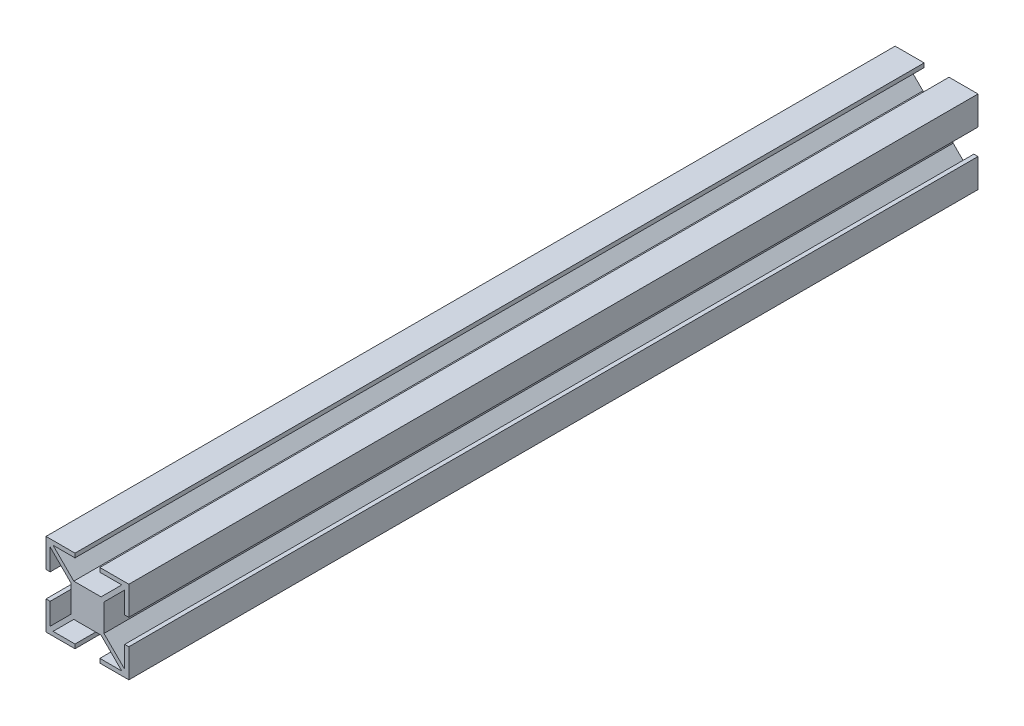
ISO-10303-21;
HEADER;
FILE_DESCRIPTION(('STEP AP214'),'2;1');
FILE_NAME('part.step','',(''),(''),'','','');
FILE_SCHEMA(('AUTOMOTIVE_DESIGN { 1 0 10303 214 1 1 1 1 }'));
ENDSEC;
DATA;
#1=APPLICATION_CONTEXT('core data for automotive mechanical design processes');
#2=APPLICATION_PROTOCOL_DEFINITION('international standard','automotive_design',2000,#1);
#3=PRODUCT_CONTEXT('',#1,'mechanical');
#4=PRODUCT('Part','Part','',(#3));
#5=PRODUCT_RELATED_PRODUCT_CATEGORY('part','',(#4));
#6=PRODUCT_DEFINITION_FORMATION('','',#4);
#7=PRODUCT_DEFINITION_CONTEXT('part definition',#1,'design');
#8=PRODUCT_DEFINITION('design','',#6,#7);
#9=PRODUCT_DEFINITION_SHAPE('','',#8);
#10=(LENGTH_UNIT() NAMED_UNIT(*) SI_UNIT(.MILLI.,.METRE.));
#11=(NAMED_UNIT(*) PLANE_ANGLE_UNIT() SI_UNIT($,.RADIAN.));
#12=(NAMED_UNIT(*) SI_UNIT($,.STERADIAN.) SOLID_ANGLE_UNIT());
#13=UNCERTAINTY_MEASURE_WITH_UNIT(LENGTH_MEASURE(1.E-05),#10,'distance_accuracy_value','');
#14=(GEOMETRIC_REPRESENTATION_CONTEXT(3) GLOBAL_UNCERTAINTY_ASSIGNED_CONTEXT((#13)) GLOBAL_UNIT_ASSIGNED_CONTEXT((#10,
#11,#12)) REPRESENTATION_CONTEXT('',''));
#15=CARTESIAN_POINT('',(0.,0.,0.));
#16=DIRECTION('',(0.,0.,1.));
#17=DIRECTION('',(1.,0.,0.));
#18=AXIS2_PLACEMENT_3D('',#15,#16,#17);
#19=CARTESIAN_POINT('',(10.,10.,205.));
#20=DIRECTION('',(0.,-1.,0.));
#21=DIRECTION('',(0.,0.,-1.));
#22=AXIS2_PLACEMENT_3D('',#19,#20,#21);
#23=PLANE('',#22);
#24=DIRECTION('',(-1.,0.,0.));
#25=VECTOR('',#24,1.);
#26=CARTESIAN_POINT('',(10.,10.,0.));
#27=LINE('',#26,#25);
#28=CARTESIAN_POINT('',(10.,10.,0.));
#29=VERTEX_POINT('',#28);
#30=CARTESIAN_POINT('',(3.,10.,0.));
#31=VERTEX_POINT('',#30);
#32=EDGE_CURVE('E297',#29,#31,#27,.T.);
#33=ORIENTED_EDGE('',*,*,#32,.T.);
#34=DIRECTION('',(0.,0.,-1.));
#35=VECTOR('',#34,1.);
#36=CARTESIAN_POINT('',(3.,10.,205.));
#37=LINE('',#36,#35);
#38=CARTESIAN_POINT('',(3.,10.,205.));
#39=VERTEX_POINT('',#38);
#40=EDGE_CURVE('E11',#39,#31,#37,.T.);
#41=ORIENTED_EDGE('',*,*,#40,.F.);
#42=DIRECTION('',(-1.,0.,0.));
#43=VECTOR('',#42,1.);
#44=CARTESIAN_POINT('',(10.,10.,205.));
#45=LINE('',#44,#43);
#46=CARTESIAN_POINT('',(10.,10.,205.));
#47=VERTEX_POINT('',#46);
#48=EDGE_CURVE('E367',#47,#39,#45,.T.);
#49=ORIENTED_EDGE('',*,*,#48,.F.);
#50=DIRECTION('',(0.,0.,-1.));
#51=VECTOR('',#50,1.);
#52=CARTESIAN_POINT('',(10.,10.,205.));
#53=LINE('',#52,#51);
#54=EDGE_CURVE('E293',#47,#29,#53,.T.);
#55=ORIENTED_EDGE('',*,*,#54,.T.);
#56=EDGE_LOOP('',(#33,#41,#49,#55));
#57=FACE_BOUND('',#56,.T.);
#58=ADVANCED_FACE('F33',(#57),#23,.F.);
#59=CARTESIAN_POINT('',(3.,10.,205.));
#60=DIRECTION('',(1.,0.,0.));
#61=DIRECTION('',(0.,0.,-1.));
#62=AXIS2_PLACEMENT_3D('',#59,#60,#61);
#63=PLANE('',#62);
#64=DIRECTION('',(0.,-1.,0.));
#65=VECTOR('',#64,1.);
#66=CARTESIAN_POINT('',(3.,10.,0.));
#67=LINE('',#66,#65);
#68=CARTESIAN_POINT('',(3.,9.,0.));
#69=VERTEX_POINT('',#68);
#70=EDGE_CURVE('E300',#31,#69,#67,.T.);
#71=ORIENTED_EDGE('',*,*,#70,.T.);
#72=DIRECTION('',(0.,0.,-1.));
#73=VECTOR('',#72,1.);
#74=CARTESIAN_POINT('',(3.,9.,205.));
#75=LINE('',#74,#73);
#76=CARTESIAN_POINT('',(3.,9.,205.));
#77=VERTEX_POINT('',#76);
#78=EDGE_CURVE('E41',#77,#69,#75,.T.);
#79=ORIENTED_EDGE('',*,*,#78,.F.);
#80=DIRECTION('',(0.,-1.,0.));
#81=VECTOR('',#80,1.);
#82=CARTESIAN_POINT('',(3.,10.,205.));
#83=LINE('',#82,#81);
#84=EDGE_CURVE('E176',#39,#77,#83,.T.);
#85=ORIENTED_EDGE('',*,*,#84,.F.);
#86=ORIENTED_EDGE('',*,*,#40,.T.);
#87=EDGE_LOOP('',(#71,#79,#85,#86));
#88=FACE_BOUND('',#87,.T.);
#89=ADVANCED_FACE('F565',(#88),#63,.F.);
#90=CARTESIAN_POINT('',(8.29289321881345,9.,205.));
#91=DIRECTION('',(0.,1.,0.));
#92=DIRECTION('',(0.,0.,1.));
#93=AXIS2_PLACEMENT_3D('',#90,#91,#92);
#94=PLANE('',#93);
#95=DIRECTION('',(1.,0.,0.));
#96=VECTOR('',#95,1.);
#97=CARTESIAN_POINT('',(8.29289321881345,9.,0.));
#98=LINE('',#97,#96);
#99=CARTESIAN_POINT('',(8.29289321881345,9.,0.));
#100=VERTEX_POINT('',#99);
#101=EDGE_CURVE('E302',#69,#100,#98,.T.);
#102=ORIENTED_EDGE('',*,*,#101,.T.);
#103=DIRECTION('',(0.,0.,-1.));
#104=VECTOR('',#103,1.);
#105=CARTESIAN_POINT('',(8.29289321881345,9.,205.));
#106=LINE('',#105,#104);
#107=CARTESIAN_POINT('',(8.29289321881345,9.,205.));
#108=VERTEX_POINT('',#107);
#109=EDGE_CURVE('E458',#108,#100,#106,.T.);
#110=ORIENTED_EDGE('',*,*,#109,.F.);
#111=DIRECTION('',(1.,0.,0.));
#112=VECTOR('',#111,1.);
#113=CARTESIAN_POINT('',(8.29289321881345,9.,205.));
#114=LINE('',#113,#112);
#115=EDGE_CURVE('E466',#77,#108,#114,.T.);
#116=ORIENTED_EDGE('',*,*,#115,.F.);
#117=ORIENTED_EDGE('',*,*,#78,.T.);
#118=EDGE_LOOP('',(#102,#110,#116,#117));
#119=FACE_BOUND('',#118,.T.);
#120=ADVANCED_FACE('F464',(#119),#94,.F.);
#121=CARTESIAN_POINT('',(8.29289321881345,9.,205.));
#122=DIRECTION('',(0.707106781186548,-0.707106781186547,0.));
#123=DIRECTION('',(0.707106781186547,0.707106781186548,0.));
#124=AXIS2_PLACEMENT_3D('',#121,#122,#123);
#125=PLANE('',#124);
#126=DIRECTION('',(-0.707106781186547,-0.707106781186548,0.));
#127=VECTOR('',#126,1.);
#128=CARTESIAN_POINT('',(8.29289321881345,9.,0.));
#129=LINE('',#128,#127);
#130=CARTESIAN_POINT('',(3.29289321881345,4.,0.));
#131=VERTEX_POINT('',#130);
#132=EDGE_CURVE('E304',#100,#131,#129,.T.);
#133=ORIENTED_EDGE('',*,*,#132,.T.);
#134=DIRECTION('',(0.,0.,-1.));
#135=VECTOR('',#134,1.);
#136=CARTESIAN_POINT('',(3.29289321881345,4.,205.));
#137=LINE('',#136,#135);
#138=CARTESIAN_POINT('',(3.29289321881345,4.,205.));
#139=VERTEX_POINT('',#138);
#140=EDGE_CURVE('E455',#139,#131,#137,.T.);
#141=ORIENTED_EDGE('',*,*,#140,.F.);
#142=DIRECTION('',(-0.707106781186547,-0.707106781186548,0.));
#143=VECTOR('',#142,1.);
#144=CARTESIAN_POINT('',(8.29289321881345,9.,205.));
#145=LINE('',#144,#143);
#146=EDGE_CURVE('E484',#108,#139,#145,.T.);
#147=ORIENTED_EDGE('',*,*,#146,.F.);
#148=ORIENTED_EDGE('',*,*,#109,.T.);
#149=EDGE_LOOP('',(#133,#141,#147,#148));
#150=FACE_BOUND('',#149,.T.);
#151=ADVANCED_FACE('F475',(#150),#125,.F.);
#152=CARTESIAN_POINT('',(-3.29289321881345,4.,205.));
#153=DIRECTION('',(0.,-1.,0.));
#154=DIRECTION('',(0.,0.,-1.));
#155=AXIS2_PLACEMENT_3D('',#152,#153,#154);
#156=PLANE('',#155);
#157=DIRECTION('',(-1.,0.,0.));
#158=VECTOR('',#157,1.);
#159=CARTESIAN_POINT('',(-3.29289321881345,4.,0.));
#160=LINE('',#159,#158);
#161=CARTESIAN_POINT('',(-3.29289321881345,4.,0.));
#162=VERTEX_POINT('',#161);
#163=EDGE_CURVE('E306',#131,#162,#160,.T.);
#164=ORIENTED_EDGE('',*,*,#163,.T.);
#165=DIRECTION('',(0.,0.,-1.));
#166=VECTOR('',#165,1.);
#167=CARTESIAN_POINT('',(-3.29289321881345,4.,205.));
#168=LINE('',#167,#166);
#169=CARTESIAN_POINT('',(-3.29289321881345,4.,205.));
#170=VERTEX_POINT('',#169);
#171=EDGE_CURVE('E452',#170,#162,#168,.T.);
#172=ORIENTED_EDGE('',*,*,#171,.F.);
#173=DIRECTION('',(-1.,0.,0.));
#174=VECTOR('',#173,1.);
#175=CARTESIAN_POINT('',(-3.29289321881345,4.,205.));
#176=LINE('',#175,#174);
#177=EDGE_CURVE('E481',#139,#170,#176,.T.);
#178=ORIENTED_EDGE('',*,*,#177,.F.);
#179=ORIENTED_EDGE('',*,*,#140,.T.);
#180=EDGE_LOOP('',(#164,#172,#178,#179));
#181=FACE_BOUND('',#180,.T.);
#182=ADVANCED_FACE('F479',(#181),#156,.F.);
#183=CARTESIAN_POINT('',(-8.29289321881345,9.,205.));
#184=DIRECTION('',(-0.707106781186548,-0.707106781186547,0.));
#185=DIRECTION('',(0.707106781186547,-0.707106781186548,0.));
#186=AXIS2_PLACEMENT_3D('',#183,#184,#185);
#187=PLANE('',#186);
#188=DIRECTION('',(-0.707106781186547,0.707106781186548,0.));
#189=VECTOR('',#188,1.);
#190=CARTESIAN_POINT('',(-8.29289321881345,9.,0.));
#191=LINE('',#190,#189);
#192=CARTESIAN_POINT('',(-8.29289321881345,9.,0.));
#193=VERTEX_POINT('',#192);
#194=EDGE_CURVE('E308',#162,#193,#191,.T.);
#195=ORIENTED_EDGE('',*,*,#194,.T.);
#196=DIRECTION('',(0.,0.,-1.));
#197=VECTOR('',#196,1.);
#198=CARTESIAN_POINT('',(-8.29289321881345,9.,205.));
#199=LINE('',#198,#197);
#200=CARTESIAN_POINT('',(-8.29289321881345,9.,205.));
#201=VERTEX_POINT('',#200);
#202=EDGE_CURVE('E449',#201,#193,#199,.T.);
#203=ORIENTED_EDGE('',*,*,#202,.F.);
#204=DIRECTION('',(-0.707106781186547,0.707106781186548,0.));
#205=VECTOR('',#204,1.);
#206=CARTESIAN_POINT('',(-8.29289321881345,9.,205.));
#207=LINE('',#206,#205);
#208=EDGE_CURVE('E483',#170,#201,#207,.T.);
#209=ORIENTED_EDGE('',*,*,#208,.F.);
#210=ORIENTED_EDGE('',*,*,#171,.T.);
#211=EDGE_LOOP('',(#195,#203,#209,#210));
#212=FACE_BOUND('',#211,.T.);
#213=ADVANCED_FACE('F578',(#212),#187,.F.);
#214=CARTESIAN_POINT('',(-8.29289321881345,9.,205.));
#215=DIRECTION('',(0.,1.,0.));
#216=DIRECTION('',(0.,0.,1.));
#217=AXIS2_PLACEMENT_3D('',#214,#215,#216);
#218=PLANE('',#217);
#219=DIRECTION('',(1.,0.,0.));
#220=VECTOR('',#219,1.);
#221=CARTESIAN_POINT('',(-8.29289321881345,9.,0.));
#222=LINE('',#221,#220);
#223=CARTESIAN_POINT('',(-3.,9.,0.));
#224=VERTEX_POINT('',#223);
#225=EDGE_CURVE('E310',#193,#224,#222,.T.);
#226=ORIENTED_EDGE('',*,*,#225,.T.);
#227=DIRECTION('',(0.,0.,-1.));
#228=VECTOR('',#227,1.);
#229=CARTESIAN_POINT('',(-3.,9.,205.));
#230=LINE('',#229,#228);
#231=CARTESIAN_POINT('',(-3.,9.,205.));
#232=VERTEX_POINT('',#231);
#233=EDGE_CURVE('E446',#232,#224,#230,.T.);
#234=ORIENTED_EDGE('',*,*,#233,.F.);
#235=DIRECTION('',(1.,0.,0.));
#236=VECTOR('',#235,1.);
#237=CARTESIAN_POINT('',(-8.29289321881345,9.,205.));
#238=LINE('',#237,#236);
#239=EDGE_CURVE('E486',#201,#232,#238,.T.);
#240=ORIENTED_EDGE('',*,*,#239,.F.);
#241=ORIENTED_EDGE('',*,*,#202,.T.);
#242=EDGE_LOOP('',(#226,#234,#240,#241));
#243=FACE_BOUND('',#242,.T.);
#244=ADVANCED_FACE('F581',(#243),#218,.F.);
#245=CARTESIAN_POINT('',(-3.,10.,205.));
#246=DIRECTION('',(-1.,0.,0.));
#247=DIRECTION('',(0.,0.,1.));
#248=AXIS2_PLACEMENT_3D('',#245,#246,#247);
#249=PLANE('',#248);
#250=DIRECTION('',(0.,1.,0.));
#251=VECTOR('',#250,1.);
#252=CARTESIAN_POINT('',(-3.,10.,0.));
#253=LINE('',#252,#251);
#254=CARTESIAN_POINT('',(-3.,10.,0.));
#255=VERTEX_POINT('',#254);
#256=EDGE_CURVE('E312',#224,#255,#253,.T.);
#257=ORIENTED_EDGE('',*,*,#256,.T.);
#258=DIRECTION('',(0.,0.,-1.));
#259=VECTOR('',#258,1.);
#260=CARTESIAN_POINT('',(-3.,10.,205.));
#261=LINE('',#260,#259);
#262=CARTESIAN_POINT('',(-3.,10.,205.));
#263=VERTEX_POINT('',#262);
#264=EDGE_CURVE('E443',#263,#255,#261,.T.);
#265=ORIENTED_EDGE('',*,*,#264,.F.);
#266=DIRECTION('',(0.,1.,0.));
#267=VECTOR('',#266,1.);
#268=CARTESIAN_POINT('',(-3.,10.,205.));
#269=LINE('',#268,#267);
#270=EDGE_CURVE('E492',#232,#263,#269,.T.);
#271=ORIENTED_EDGE('',*,*,#270,.F.);
#272=ORIENTED_EDGE('',*,*,#233,.T.);
#273=EDGE_LOOP('',(#257,#265,#271,#272));
#274=FACE_BOUND('',#273,.T.);
#275=ADVANCED_FACE('F585',(#274),#249,.F.);
#276=CARTESIAN_POINT('',(-10.,10.,205.));
#277=DIRECTION('',(0.,-1.,0.));
#278=DIRECTION('',(0.,0.,-1.));
#279=AXIS2_PLACEMENT_3D('',#276,#277,#278);
#280=PLANE('',#279);
#281=DIRECTION('',(-1.,0.,0.));
#282=VECTOR('',#281,1.);
#283=CARTESIAN_POINT('',(-10.,10.,0.));
#284=LINE('',#283,#282);
#285=CARTESIAN_POINT('',(-10.,10.,0.));
#286=VERTEX_POINT('',#285);
#287=EDGE_CURVE('E314',#255,#286,#284,.T.);
#288=ORIENTED_EDGE('',*,*,#287,.T.);
#289=DIRECTION('',(0.,0.,-1.));
#290=VECTOR('',#289,1.);
#291=CARTESIAN_POINT('',(-10.,10.,205.));
#292=LINE('',#291,#290);
#293=CARTESIAN_POINT('',(-10.,10.,205.));
#294=VERTEX_POINT('',#293);
#295=EDGE_CURVE('E440',#294,#286,#292,.T.);
#296=ORIENTED_EDGE('',*,*,#295,.F.);
#297=DIRECTION('',(-1.,0.,0.));
#298=VECTOR('',#297,1.);
#299=CARTESIAN_POINT('',(-10.,10.,205.));
#300=LINE('',#299,#298);
#301=EDGE_CURVE('E494',#263,#294,#300,.T.);
#302=ORIENTED_EDGE('',*,*,#301,.F.);
#303=ORIENTED_EDGE('',*,*,#264,.T.);
#304=EDGE_LOOP('',(#288,#296,#302,#303));
#305=FACE_BOUND('',#304,.T.);
#306=ADVANCED_FACE('F589',(#305),#280,.F.);
#307=CARTESIAN_POINT('',(-10.,10.,205.));
#308=DIRECTION('',(1.,0.,0.));
#309=DIRECTION('',(0.,0.,-1.));
#310=AXIS2_PLACEMENT_3D('',#307,#308,#309);
#311=PLANE('',#310);
#312=DIRECTION('',(0.,-1.,0.));
#313=VECTOR('',#312,1.);
#314=CARTESIAN_POINT('',(-10.,10.,0.));
#315=LINE('',#314,#313);
#316=CARTESIAN_POINT('',(-10.,3.07404458598726,0.));
#317=VERTEX_POINT('',#316);
#318=EDGE_CURVE('E316',#286,#317,#315,.T.);
#319=ORIENTED_EDGE('',*,*,#318,.T.);
#320=DIRECTION('',(0.,0.,-1.));
#321=VECTOR('',#320,1.);
#322=CARTESIAN_POINT('',(-10.,3.07404458598726,205.));
#323=LINE('',#322,#321);
#324=CARTESIAN_POINT('',(-10.,3.07404458598726,205.));
#325=VERTEX_POINT('',#324);
#326=EDGE_CURVE('E437',#325,#317,#323,.T.);
#327=ORIENTED_EDGE('',*,*,#326,.F.);
#328=DIRECTION('',(0.,-1.,0.));
#329=VECTOR('',#328,1.);
#330=CARTESIAN_POINT('',(-10.,10.,205.));
#331=LINE('',#330,#329);
#332=EDGE_CURVE('E496',#294,#325,#331,.T.);
#333=ORIENTED_EDGE('',*,*,#332,.F.);
#334=ORIENTED_EDGE('',*,*,#295,.T.);
#335=EDGE_LOOP('',(#319,#327,#333,#334));
#336=FACE_BOUND('',#335,.T.);
#337=ADVANCED_FACE('F593',(#336),#311,.F.);
#338=CARTESIAN_POINT('',(-10.,3.07404458598726,205.));
#339=DIRECTION('',(0.,1.,0.));
#340=DIRECTION('',(0.,0.,1.));
#341=AXIS2_PLACEMENT_3D('',#338,#339,#340);
#342=PLANE('',#341);
#343=DIRECTION('',(1.,0.,0.));
#344=VECTOR('',#343,1.);
#345=CARTESIAN_POINT('',(-10.,3.07404458598726,0.));
#346=LINE('',#345,#344);
#347=CARTESIAN_POINT('',(-9.,3.07404458598726,0.));
#348=VERTEX_POINT('',#347);
#349=EDGE_CURVE('E318',#317,#348,#346,.T.);
#350=ORIENTED_EDGE('',*,*,#349,.T.);
#351=DIRECTION('',(0.,0.,-1.));
#352=VECTOR('',#351,1.);
#353=CARTESIAN_POINT('',(-9.,3.07404458598726,205.));
#354=LINE('',#353,#352);
#355=CARTESIAN_POINT('',(-9.,3.07404458598726,205.));
#356=VERTEX_POINT('',#355);
#357=EDGE_CURVE('E434',#356,#348,#354,.T.);
#358=ORIENTED_EDGE('',*,*,#357,.F.);
#359=DIRECTION('',(1.,0.,0.));
#360=VECTOR('',#359,1.);
#361=CARTESIAN_POINT('',(-10.,3.07404458598726,205.));
#362=LINE('',#361,#360);
#363=EDGE_CURVE('E498',#325,#356,#362,.T.);
#364=ORIENTED_EDGE('',*,*,#363,.F.);
#365=ORIENTED_EDGE('',*,*,#326,.T.);
#366=EDGE_LOOP('',(#350,#358,#364,#365));
#367=FACE_BOUND('',#366,.T.);
#368=ADVANCED_FACE('F597',(#367),#342,.F.);
#369=CARTESIAN_POINT('',(-9.,8.29289321881345,205.));
#370=DIRECTION('',(-1.,0.,0.));
#371=DIRECTION('',(0.,0.,1.));
#372=AXIS2_PLACEMENT_3D('',#369,#370,#371);
#373=PLANE('',#372);
#374=DIRECTION('',(0.,1.,0.));
#375=VECTOR('',#374,1.);
#376=CARTESIAN_POINT('',(-9.,8.29289321881345,0.));
#377=LINE('',#376,#375);
#378=CARTESIAN_POINT('',(-9.,8.29289321881345,0.));
#379=VERTEX_POINT('',#378);
#380=EDGE_CURVE('E320',#348,#379,#377,.T.);
#381=ORIENTED_EDGE('',*,*,#380,.T.);
#382=DIRECTION('',(0.,0.,-1.));
#383=VECTOR('',#382,1.);
#384=CARTESIAN_POINT('',(-9.,8.29289321881345,205.));
#385=LINE('',#384,#383);
#386=CARTESIAN_POINT('',(-9.,8.29289321881345,205.));
#387=VERTEX_POINT('',#386);
#388=EDGE_CURVE('E431',#387,#379,#385,.T.);
#389=ORIENTED_EDGE('',*,*,#388,.F.);
#390=DIRECTION('',(0.,1.,0.));
#391=VECTOR('',#390,1.);
#392=CARTESIAN_POINT('',(-9.,8.29289321881345,205.));
#393=LINE('',#392,#391);
#394=EDGE_CURVE('E500',#356,#387,#393,.T.);
#395=ORIENTED_EDGE('',*,*,#394,.F.);
#396=ORIENTED_EDGE('',*,*,#357,.T.);
#397=EDGE_LOOP('',(#381,#389,#395,#396));
#398=FACE_BOUND('',#397,.T.);
#399=ADVANCED_FACE('F601',(#398),#373,.F.);
#400=CARTESIAN_POINT('',(-9.,8.29289321881345,205.));
#401=DIRECTION('',(0.707106781186547,0.707106781186547,0.));
#402=DIRECTION('',(-0.707106781186548,0.707106781186548,0.));
#403=AXIS2_PLACEMENT_3D('',#400,#401,#402);
#404=PLANE('',#403);
#405=DIRECTION('',(0.707106781186547,-0.707106781186547,0.));
#406=VECTOR('',#405,1.);
#407=CARTESIAN_POINT('',(-9.,8.29289321881345,0.));
#408=LINE('',#407,#406);
#409=CARTESIAN_POINT('',(-4.,3.29289321881345,0.));
#410=VERTEX_POINT('',#409);
#411=EDGE_CURVE('E322',#379,#410,#408,.T.);
#412=ORIENTED_EDGE('',*,*,#411,.T.);
#413=DIRECTION('',(0.,0.,-1.));
#414=VECTOR('',#413,1.);
#415=CARTESIAN_POINT('',(-4.,3.29289321881345,205.));
#416=LINE('',#415,#414);
#417=CARTESIAN_POINT('',(-4.,3.29289321881345,205.));
#418=VERTEX_POINT('',#417);
#419=EDGE_CURVE('E428',#418,#410,#416,.T.);
#420=ORIENTED_EDGE('',*,*,#419,.F.);
#421=DIRECTION('',(0.707106781186547,-0.707106781186547,0.));
#422=VECTOR('',#421,1.);
#423=CARTESIAN_POINT('',(-9.,8.29289321881345,205.));
#424=LINE('',#423,#422);
#425=EDGE_CURVE('E502',#387,#418,#424,.T.);
#426=ORIENTED_EDGE('',*,*,#425,.F.);
#427=ORIENTED_EDGE('',*,*,#388,.T.);
#428=EDGE_LOOP('',(#412,#420,#426,#427));
#429=FACE_BOUND('',#428,.T.);
#430=ADVANCED_FACE('F605',(#429),#404,.F.);
#431=CARTESIAN_POINT('',(-4.,-3.29289321881345,205.));
#432=DIRECTION('',(1.,0.,0.));
#433=DIRECTION('',(0.,0.,-1.));
#434=AXIS2_PLACEMENT_3D('',#431,#432,#433);
#435=PLANE('',#434);
#436=DIRECTION('',(0.,-1.,0.));
#437=VECTOR('',#436,1.);
#438=CARTESIAN_POINT('',(-4.,-3.29289321881345,0.));
#439=LINE('',#438,#437);
#440=CARTESIAN_POINT('',(-4.,-3.29289321881345,0.));
#441=VERTEX_POINT('',#440);
#442=EDGE_CURVE('E324',#410,#441,#439,.T.);
#443=ORIENTED_EDGE('',*,*,#442,.T.);
#444=DIRECTION('',(0.,0.,-1.));
#445=VECTOR('',#444,1.);
#446=CARTESIAN_POINT('',(-4.,-3.29289321881345,205.));
#447=LINE('',#446,#445);
#448=CARTESIAN_POINT('',(-4.,-3.29289321881345,205.));
#449=VERTEX_POINT('',#448);
#450=EDGE_CURVE('E425',#449,#441,#447,.T.);
#451=ORIENTED_EDGE('',*,*,#450,.F.);
#452=DIRECTION('',(0.,-1.,0.));
#453=VECTOR('',#452,1.);
#454=CARTESIAN_POINT('',(-4.,-3.29289321881345,205.));
#455=LINE('',#454,#453);
#456=EDGE_CURVE('E504',#418,#449,#455,.T.);
#457=ORIENTED_EDGE('',*,*,#456,.F.);
#458=ORIENTED_EDGE('',*,*,#419,.T.);
#459=EDGE_LOOP('',(#443,#451,#457,#458));
#460=FACE_BOUND('',#459,.T.);
#461=ADVANCED_FACE('F609',(#460),#435,.F.);
#462=CARTESIAN_POINT('',(-9.,-8.29289321881345,205.));
#463=DIRECTION('',(0.707106781186547,-0.707106781186547,0.));
#464=DIRECTION('',(0.707106781186548,0.707106781186548,0.));
#465=AXIS2_PLACEMENT_3D('',#462,#463,#464);
#466=PLANE('',#465);
#467=DIRECTION('',(-0.707106781186547,-0.707106781186547,0.));
#468=VECTOR('',#467,1.);
#469=CARTESIAN_POINT('',(-9.,-8.29289321881345,0.));
#470=LINE('',#469,#468);
#471=CARTESIAN_POINT('',(-9.,-8.29289321881345,0.));
#472=VERTEX_POINT('',#471);
#473=EDGE_CURVE('E326',#441,#472,#470,.T.);
#474=ORIENTED_EDGE('',*,*,#473,.T.);
#475=DIRECTION('',(0.,0.,-1.));
#476=VECTOR('',#475,1.);
#477=CARTESIAN_POINT('',(-9.,-8.29289321881345,205.));
#478=LINE('',#477,#476);
#479=CARTESIAN_POINT('',(-9.,-8.29289321881345,205.));
#480=VERTEX_POINT('',#479);
#481=EDGE_CURVE('E422',#480,#472,#478,.T.);
#482=ORIENTED_EDGE('',*,*,#481,.F.);
#483=DIRECTION('',(-0.707106781186547,-0.707106781186547,0.));
#484=VECTOR('',#483,1.);
#485=CARTESIAN_POINT('',(-9.,-8.29289321881345,205.));
#486=LINE('',#485,#484);
#487=EDGE_CURVE('E506',#449,#480,#486,.T.);
#488=ORIENTED_EDGE('',*,*,#487,.F.);
#489=ORIENTED_EDGE('',*,*,#450,.T.);
#490=EDGE_LOOP('',(#474,#482,#488,#489));
#491=FACE_BOUND('',#490,.T.);
#492=ADVANCED_FACE('F613',(#491),#466,.F.);
#493=CARTESIAN_POINT('',(-9.,-8.29289321881345,205.));
#494=DIRECTION('',(-1.,0.,0.));
#495=DIRECTION('',(0.,0.,1.));
#496=AXIS2_PLACEMENT_3D('',#493,#494,#495);
#497=PLANE('',#496);
#498=DIRECTION('',(0.,1.,0.));
#499=VECTOR('',#498,1.);
#500=CARTESIAN_POINT('',(-9.,-8.29289321881345,0.));
#501=LINE('',#500,#499);
#502=CARTESIAN_POINT('',(-9.,-3.07404458598726,0.));
#503=VERTEX_POINT('',#502);
#504=EDGE_CURVE('E328',#472,#503,#501,.T.);
#505=ORIENTED_EDGE('',*,*,#504,.T.);
#506=DIRECTION('',(0.,0.,-1.));
#507=VECTOR('',#506,1.);
#508=CARTESIAN_POINT('',(-9.,-3.07404458598726,205.));
#509=LINE('',#508,#507);
#510=CARTESIAN_POINT('',(-9.,-3.07404458598726,205.));
#511=VERTEX_POINT('',#510);
#512=EDGE_CURVE('E419',#511,#503,#509,.T.);
#513=ORIENTED_EDGE('',*,*,#512,.F.);
#514=DIRECTION('',(0.,1.,0.));
#515=VECTOR('',#514,1.);
#516=CARTESIAN_POINT('',(-9.,-8.29289321881345,205.));
#517=LINE('',#516,#515);
#518=EDGE_CURVE('E508',#480,#511,#517,.T.);
#519=ORIENTED_EDGE('',*,*,#518,.F.);
#520=ORIENTED_EDGE('',*,*,#481,.T.);
#521=EDGE_LOOP('',(#505,#513,#519,#520));
#522=FACE_BOUND('',#521,.T.);
#523=ADVANCED_FACE('F617',(#522),#497,.F.);
#524=CARTESIAN_POINT('',(-10.,-3.07404458598726,205.));
#525=DIRECTION('',(0.,-1.,0.));
#526=DIRECTION('',(0.,0.,-1.));
#527=AXIS2_PLACEMENT_3D('',#524,#525,#526);
#528=PLANE('',#527);
#529=DIRECTION('',(-1.,0.,0.));
#530=VECTOR('',#529,1.);
#531=CARTESIAN_POINT('',(-10.,-3.07404458598726,0.));
#532=LINE('',#531,#530);
#533=CARTESIAN_POINT('',(-10.,-3.07404458598726,0.));
#534=VERTEX_POINT('',#533);
#535=EDGE_CURVE('E330',#503,#534,#532,.T.);
#536=ORIENTED_EDGE('',*,*,#535,.T.);
#537=DIRECTION('',(0.,0.,-1.));
#538=VECTOR('',#537,1.);
#539=CARTESIAN_POINT('',(-10.,-3.07404458598726,205.));
#540=LINE('',#539,#538);
#541=CARTESIAN_POINT('',(-10.,-3.07404458598726,205.));
#542=VERTEX_POINT('',#541);
#543=EDGE_CURVE('E416',#542,#534,#540,.T.);
#544=ORIENTED_EDGE('',*,*,#543,.F.);
#545=DIRECTION('',(-1.,0.,0.));
#546=VECTOR('',#545,1.);
#547=CARTESIAN_POINT('',(-10.,-3.07404458598726,205.));
#548=LINE('',#547,#546);
#549=EDGE_CURVE('E510',#511,#542,#548,.T.);
#550=ORIENTED_EDGE('',*,*,#549,.F.);
#551=ORIENTED_EDGE('',*,*,#512,.T.);
#552=EDGE_LOOP('',(#536,#544,#550,#551));
#553=FACE_BOUND('',#552,.T.);
#554=ADVANCED_FACE('F621',(#553),#528,.F.);
#555=CARTESIAN_POINT('',(-10.,-10.,205.));
#556=DIRECTION('',(1.,0.,0.));
#557=DIRECTION('',(0.,0.,-1.));
#558=AXIS2_PLACEMENT_3D('',#555,#556,#557);
#559=PLANE('',#558);
#560=DIRECTION('',(0.,-1.,0.));
#561=VECTOR('',#560,1.);
#562=CARTESIAN_POINT('',(-10.,-10.,0.));
#563=LINE('',#562,#561);
#564=CARTESIAN_POINT('',(-10.,-10.,0.));
#565=VERTEX_POINT('',#564);
#566=EDGE_CURVE('E332',#534,#565,#563,.T.);
#567=ORIENTED_EDGE('',*,*,#566,.T.);
#568=DIRECTION('',(0.,0.,-1.));
#569=VECTOR('',#568,1.);
#570=CARTESIAN_POINT('',(-10.,-10.,205.));
#571=LINE('',#570,#569);
#572=CARTESIAN_POINT('',(-10.,-10.,205.));
#573=VERTEX_POINT('',#572);
#574=EDGE_CURVE('E413',#573,#565,#571,.T.);
#575=ORIENTED_EDGE('',*,*,#574,.F.);
#576=DIRECTION('',(0.,-1.,0.));
#577=VECTOR('',#576,1.);
#578=CARTESIAN_POINT('',(-10.,-10.,205.));
#579=LINE('',#578,#577);
#580=EDGE_CURVE('E512',#542,#573,#579,.T.);
#581=ORIENTED_EDGE('',*,*,#580,.F.);
#582=ORIENTED_EDGE('',*,*,#543,.T.);
#583=EDGE_LOOP('',(#567,#575,#581,#582));
#584=FACE_BOUND('',#583,.T.);
#585=ADVANCED_FACE('F625',(#584),#559,.F.);
#586=CARTESIAN_POINT('',(-10.,-10.,205.));
#587=DIRECTION('',(0.,1.,0.));
#588=DIRECTION('',(-1.,0.,0.));
#589=AXIS2_PLACEMENT_3D('',#586,#587,#588);
#590=PLANE('',#589);
#591=DIRECTION('',(1.,0.,0.));
#592=VECTOR('',#591,1.);
#593=CARTESIAN_POINT('',(-10.,-10.,0.));
#594=LINE('',#593,#592);
#595=CARTESIAN_POINT('',(-3.,-10.,0.));
#596=VERTEX_POINT('',#595);
#597=EDGE_CURVE('E334',#565,#596,#594,.T.);
#598=ORIENTED_EDGE('',*,*,#597,.T.);
#599=DIRECTION('',(0.,0.,-1.));
#600=VECTOR('',#599,1.);
#601=CARTESIAN_POINT('',(-3.,-10.,205.));
#602=LINE('',#601,#600);
#603=CARTESIAN_POINT('',(-3.,-10.,205.));
#604=VERTEX_POINT('',#603);
#605=EDGE_CURVE('E410',#604,#596,#602,.T.);
#606=ORIENTED_EDGE('',*,*,#605,.F.);
#607=DIRECTION('',(1.,0.,0.));
#608=VECTOR('',#607,1.);
#609=CARTESIAN_POINT('',(-10.,-10.,205.));
#610=LINE('',#609,#608);
#611=EDGE_CURVE('E514',#573,#604,#610,.T.);
#612=ORIENTED_EDGE('',*,*,#611,.F.);
#613=ORIENTED_EDGE('',*,*,#574,.T.);
#614=EDGE_LOOP('',(#598,#606,#612,#613));
#615=FACE_BOUND('',#614,.T.);
#616=ADVANCED_FACE('F629',(#615),#590,.F.);
#617=CARTESIAN_POINT('',(-3.,-10.,205.));
#618=DIRECTION('',(-1.,0.,0.));
#619=DIRECTION('',(0.,0.,1.));
#620=AXIS2_PLACEMENT_3D('',#617,#618,#619);
#621=PLANE('',#620);
#622=DIRECTION('',(0.,1.,0.));
#623=VECTOR('',#622,1.);
#624=CARTESIAN_POINT('',(-3.,-10.,0.));
#625=LINE('',#624,#623);
#626=CARTESIAN_POINT('',(-3.,-9.,0.));
#627=VERTEX_POINT('',#626);
#628=EDGE_CURVE('E336',#596,#627,#625,.T.);
#629=ORIENTED_EDGE('',*,*,#628,.T.);
#630=DIRECTION('',(0.,0.,-1.));
#631=VECTOR('',#630,1.);
#632=CARTESIAN_POINT('',(-3.,-9.,205.));
#633=LINE('',#632,#631);
#634=CARTESIAN_POINT('',(-3.,-9.,205.));
#635=VERTEX_POINT('',#634);
#636=EDGE_CURVE('E407',#635,#627,#633,.T.);
#637=ORIENTED_EDGE('',*,*,#636,.F.);
#638=DIRECTION('',(0.,1.,0.));
#639=VECTOR('',#638,1.);
#640=CARTESIAN_POINT('',(-3.,-10.,205.));
#641=LINE('',#640,#639);
#642=EDGE_CURVE('E516',#604,#635,#641,.T.);
#643=ORIENTED_EDGE('',*,*,#642,.F.);
#644=ORIENTED_EDGE('',*,*,#605,.T.);
#645=EDGE_LOOP('',(#629,#637,#643,#644));
#646=FACE_BOUND('',#645,.T.);
#647=ADVANCED_FACE('F633',(#646),#621,.F.);
#648=CARTESIAN_POINT('',(-8.29289321881345,-9.,205.));
#649=DIRECTION('',(0.,-1.,0.));
#650=DIRECTION('',(0.,0.,-1.));
#651=AXIS2_PLACEMENT_3D('',#648,#649,#650);
#652=PLANE('',#651);
#653=DIRECTION('',(-1.,0.,0.));
#654=VECTOR('',#653,1.);
#655=CARTESIAN_POINT('',(-8.29289321881345,-9.,0.));
#656=LINE('',#655,#654);
#657=CARTESIAN_POINT('',(-8.29289321881345,-9.,0.));
#658=VERTEX_POINT('',#657);
#659=EDGE_CURVE('E338',#627,#658,#656,.T.);
#660=ORIENTED_EDGE('',*,*,#659,.T.);
#661=DIRECTION('',(0.,0.,-1.));
#662=VECTOR('',#661,1.);
#663=CARTESIAN_POINT('',(-8.29289321881345,-9.,205.));
#664=LINE('',#663,#662);
#665=CARTESIAN_POINT('',(-8.29289321881345,-9.,205.));
#666=VERTEX_POINT('',#665);
#667=EDGE_CURVE('E404',#666,#658,#664,.T.);
#668=ORIENTED_EDGE('',*,*,#667,.F.);
#669=DIRECTION('',(-1.,0.,0.));
#670=VECTOR('',#669,1.);
#671=CARTESIAN_POINT('',(-8.29289321881345,-9.,205.));
#672=LINE('',#671,#670);
#673=EDGE_CURVE('E518',#635,#666,#672,.T.);
#674=ORIENTED_EDGE('',*,*,#673,.F.);
#675=ORIENTED_EDGE('',*,*,#636,.T.);
#676=EDGE_LOOP('',(#660,#668,#674,#675));
#677=FACE_BOUND('',#676,.T.);
#678=ADVANCED_FACE('F637',(#677),#652,.F.);
#679=CARTESIAN_POINT('',(-8.29289321881345,-9.,205.));
#680=DIRECTION('',(-0.707106781186548,0.707106781186547,0.));
#681=DIRECTION('',(-0.707106781186547,-0.707106781186548,0.));
#682=AXIS2_PLACEMENT_3D('',#679,#680,#681);
#683=PLANE('',#682);
#684=DIRECTION('',(0.707106781186547,0.707106781186548,0.));
#685=VECTOR('',#684,1.);
#686=CARTESIAN_POINT('',(-8.29289321881345,-9.,0.));
#687=LINE('',#686,#685);
#688=CARTESIAN_POINT('',(-3.29289321881345,-4.,0.));
#689=VERTEX_POINT('',#688);
#690=EDGE_CURVE('E340',#658,#689,#687,.T.);
#691=ORIENTED_EDGE('',*,*,#690,.T.);
#692=DIRECTION('',(0.,0.,-1.));
#693=VECTOR('',#692,1.);
#694=CARTESIAN_POINT('',(-3.29289321881345,-4.,205.));
#695=LINE('',#694,#693);
#696=CARTESIAN_POINT('',(-3.29289321881345,-4.,205.));
#697=VERTEX_POINT('',#696);
#698=EDGE_CURVE('E401',#697,#689,#695,.T.);
#699=ORIENTED_EDGE('',*,*,#698,.F.);
#700=DIRECTION('',(0.707106781186547,0.707106781186548,0.));
#701=VECTOR('',#700,1.);
#702=CARTESIAN_POINT('',(-8.29289321881345,-9.,205.));
#703=LINE('',#702,#701);
#704=EDGE_CURVE('E520',#666,#697,#703,.T.);
#705=ORIENTED_EDGE('',*,*,#704,.F.);
#706=ORIENTED_EDGE('',*,*,#667,.T.);
#707=EDGE_LOOP('',(#691,#699,#705,#706));
#708=FACE_BOUND('',#707,.T.);
#709=ADVANCED_FACE('F641',(#708),#683,.F.);
#710=CARTESIAN_POINT('',(-3.29289321881345,-4.,205.));
#711=DIRECTION('',(0.,1.,0.));
#712=DIRECTION('',(0.,0.,1.));
#713=AXIS2_PLACEMENT_3D('',#710,#711,#712);
#714=PLANE('',#713);
#715=DIRECTION('',(1.,0.,0.));
#716=VECTOR('',#715,1.);
#717=CARTESIAN_POINT('',(-3.29289321881345,-4.,0.));
#718=LINE('',#717,#716);
#719=CARTESIAN_POINT('',(3.29289321881345,-4.,0.));
#720=VERTEX_POINT('',#719);
#721=EDGE_CURVE('E342',#689,#720,#718,.T.);
#722=ORIENTED_EDGE('',*,*,#721,.T.);
#723=DIRECTION('',(0.,0.,-1.));
#724=VECTOR('',#723,1.);
#725=CARTESIAN_POINT('',(3.29289321881345,-4.,205.));
#726=LINE('',#725,#724);
#727=CARTESIAN_POINT('',(3.29289321881345,-4.,205.));
#728=VERTEX_POINT('',#727);
#729=EDGE_CURVE('E398',#728,#720,#726,.T.);
#730=ORIENTED_EDGE('',*,*,#729,.F.);
#731=DIRECTION('',(1.,0.,0.));
#732=VECTOR('',#731,1.);
#733=CARTESIAN_POINT('',(-3.29289321881345,-4.,205.));
#734=LINE('',#733,#732);
#735=EDGE_CURVE('E522',#697,#728,#734,.T.);
#736=ORIENTED_EDGE('',*,*,#735,.F.);
#737=ORIENTED_EDGE('',*,*,#698,.T.);
#738=EDGE_LOOP('',(#722,#730,#736,#737));
#739=FACE_BOUND('',#738,.T.);
#740=ADVANCED_FACE('F645',(#739),#714,.F.);
#741=CARTESIAN_POINT('',(8.29289321881345,-9.,205.));
#742=DIRECTION('',(0.707106781186548,0.707106781186547,0.));
#743=DIRECTION('',(-0.707106781186547,0.707106781186548,0.));
#744=AXIS2_PLACEMENT_3D('',#741,#742,#743);
#745=PLANE('',#744);
#746=DIRECTION('',(0.707106781186547,-0.707106781186548,0.));
#747=VECTOR('',#746,1.);
#748=CARTESIAN_POINT('',(8.29289321881345,-9.,0.));
#749=LINE('',#748,#747);
#750=CARTESIAN_POINT('',(8.29289321881345,-9.,0.));
#751=VERTEX_POINT('',#750);
#752=EDGE_CURVE('E344',#720,#751,#749,.T.);
#753=ORIENTED_EDGE('',*,*,#752,.T.);
#754=DIRECTION('',(0.,0.,-1.));
#755=VECTOR('',#754,1.);
#756=CARTESIAN_POINT('',(8.29289321881345,-9.,205.));
#757=LINE('',#756,#755);
#758=CARTESIAN_POINT('',(8.29289321881345,-9.,205.));
#759=VERTEX_POINT('',#758);
#760=EDGE_CURVE('E395',#759,#751,#757,.T.);
#761=ORIENTED_EDGE('',*,*,#760,.F.);
#762=DIRECTION('',(0.707106781186547,-0.707106781186548,0.));
#763=VECTOR('',#762,1.);
#764=CARTESIAN_POINT('',(8.29289321881345,-9.,205.));
#765=LINE('',#764,#763);
#766=EDGE_CURVE('E524',#728,#759,#765,.T.);
#767=ORIENTED_EDGE('',*,*,#766,.F.);
#768=ORIENTED_EDGE('',*,*,#729,.T.);
#769=EDGE_LOOP('',(#753,#761,#767,#768));
#770=FACE_BOUND('',#769,.T.);
#771=ADVANCED_FACE('F649',(#770),#745,.F.);
#772=CARTESIAN_POINT('',(8.29289321881345,-9.,205.));
#773=DIRECTION('',(0.,-1.,0.));
#774=DIRECTION('',(0.,0.,-1.));
#775=AXIS2_PLACEMENT_3D('',#772,#773,#774);
#776=PLANE('',#775);
#777=DIRECTION('',(-1.,0.,0.));
#778=VECTOR('',#777,1.);
#779=CARTESIAN_POINT('',(8.29289321881345,-9.,0.));
#780=LINE('',#779,#778);
#781=CARTESIAN_POINT('',(3.,-9.,0.));
#782=VERTEX_POINT('',#781);
#783=EDGE_CURVE('E346',#751,#782,#780,.T.);
#784=ORIENTED_EDGE('',*,*,#783,.T.);
#785=DIRECTION('',(0.,0.,-1.));
#786=VECTOR('',#785,1.);
#787=CARTESIAN_POINT('',(3.,-9.,205.));
#788=LINE('',#787,#786);
#789=CARTESIAN_POINT('',(3.,-9.,205.));
#790=VERTEX_POINT('',#789);
#791=EDGE_CURVE('E392',#790,#782,#788,.T.);
#792=ORIENTED_EDGE('',*,*,#791,.F.);
#793=DIRECTION('',(-1.,0.,0.));
#794=VECTOR('',#793,1.);
#795=CARTESIAN_POINT('',(8.29289321881345,-9.,205.));
#796=LINE('',#795,#794);
#797=EDGE_CURVE('E526',#759,#790,#796,.T.);
#798=ORIENTED_EDGE('',*,*,#797,.F.);
#799=ORIENTED_EDGE('',*,*,#760,.T.);
#800=EDGE_LOOP('',(#784,#792,#798,#799));
#801=FACE_BOUND('',#800,.T.);
#802=ADVANCED_FACE('F653',(#801),#776,.F.);
#803=CARTESIAN_POINT('',(3.,-10.,205.));
#804=DIRECTION('',(1.,0.,0.));
#805=DIRECTION('',(0.,0.,-1.));
#806=AXIS2_PLACEMENT_3D('',#803,#804,#805);
#807=PLANE('',#806);
#808=DIRECTION('',(0.,-1.,0.));
#809=VECTOR('',#808,1.);
#810=CARTESIAN_POINT('',(3.,-10.,0.));
#811=LINE('',#810,#809);
#812=CARTESIAN_POINT('',(3.,-10.,0.));
#813=VERTEX_POINT('',#812);
#814=EDGE_CURVE('E348',#782,#813,#811,.T.);
#815=ORIENTED_EDGE('',*,*,#814,.T.);
#816=DIRECTION('',(0.,0.,-1.));
#817=VECTOR('',#816,1.);
#818=CARTESIAN_POINT('',(3.,-10.,205.));
#819=LINE('',#818,#817);
#820=CARTESIAN_POINT('',(3.,-10.,205.));
#821=VERTEX_POINT('',#820);
#822=EDGE_CURVE('E389',#821,#813,#819,.T.);
#823=ORIENTED_EDGE('',*,*,#822,.F.);
#824=DIRECTION('',(0.,-1.,0.));
#825=VECTOR('',#824,1.);
#826=CARTESIAN_POINT('',(3.,-10.,205.));
#827=LINE('',#826,#825);
#828=EDGE_CURVE('E528',#790,#821,#827,.T.);
#829=ORIENTED_EDGE('',*,*,#828,.F.);
#830=ORIENTED_EDGE('',*,*,#791,.T.);
#831=EDGE_LOOP('',(#815,#823,#829,#830));
#832=FACE_BOUND('',#831,.T.);
#833=ADVANCED_FACE('F657',(#832),#807,.F.);
#834=CARTESIAN_POINT('',(10.,-10.,205.));
#835=DIRECTION('',(0.,1.,0.));
#836=DIRECTION('',(-1.,0.,0.));
#837=AXIS2_PLACEMENT_3D('',#834,#835,#836);
#838=PLANE('',#837);
#839=DIRECTION('',(1.,0.,0.));
#840=VECTOR('',#839,1.);
#841=CARTESIAN_POINT('',(10.,-10.,0.));
#842=LINE('',#841,#840);
#843=CARTESIAN_POINT('',(10.,-10.,0.));
#844=VERTEX_POINT('',#843);
#845=EDGE_CURVE('E350',#813,#844,#842,.T.);
#846=ORIENTED_EDGE('',*,*,#845,.T.);
#847=DIRECTION('',(0.,0.,-1.));
#848=VECTOR('',#847,1.);
#849=CARTESIAN_POINT('',(10.,-10.,205.));
#850=LINE('',#849,#848);
#851=CARTESIAN_POINT('',(10.,-10.,205.));
#852=VERTEX_POINT('',#851);
#853=EDGE_CURVE('E386',#852,#844,#850,.T.);
#854=ORIENTED_EDGE('',*,*,#853,.F.);
#855=DIRECTION('',(1.,0.,0.));
#856=VECTOR('',#855,1.);
#857=CARTESIAN_POINT('',(10.,-10.,205.));
#858=LINE('',#857,#856);
#859=EDGE_CURVE('E530',#821,#852,#858,.T.);
#860=ORIENTED_EDGE('',*,*,#859,.F.);
#861=ORIENTED_EDGE('',*,*,#822,.T.);
#862=EDGE_LOOP('',(#846,#854,#860,#861));
#863=FACE_BOUND('',#862,.T.);
#864=ADVANCED_FACE('F661',(#863),#838,.F.);
#865=CARTESIAN_POINT('',(10.,-10.,205.));
#866=DIRECTION('',(-1.,0.,0.));
#867=DIRECTION('',(0.,0.,1.));
#868=AXIS2_PLACEMENT_3D('',#865,#866,#867);
#869=PLANE('',#868);
#870=DIRECTION('',(0.,1.,0.));
#871=VECTOR('',#870,1.);
#872=CARTESIAN_POINT('',(10.,-10.,0.));
#873=LINE('',#872,#871);
#874=CARTESIAN_POINT('',(10.,-3.07404458598726,0.));
#875=VERTEX_POINT('',#874);
#876=EDGE_CURVE('E352',#844,#875,#873,.T.);
#877=ORIENTED_EDGE('',*,*,#876,.T.);
#878=DIRECTION('',(0.,0.,-1.));
#879=VECTOR('',#878,1.);
#880=CARTESIAN_POINT('',(10.,-3.07404458598726,205.));
#881=LINE('',#880,#879);
#882=CARTESIAN_POINT('',(10.,-3.07404458598726,205.));
#883=VERTEX_POINT('',#882);
#884=EDGE_CURVE('E383',#883,#875,#881,.T.);
#885=ORIENTED_EDGE('',*,*,#884,.F.);
#886=DIRECTION('',(0.,1.,0.));
#887=VECTOR('',#886,1.);
#888=CARTESIAN_POINT('',(10.,-10.,205.));
#889=LINE('',#888,#887);
#890=EDGE_CURVE('E532',#852,#883,#889,.T.);
#891=ORIENTED_EDGE('',*,*,#890,.F.);
#892=ORIENTED_EDGE('',*,*,#853,.T.);
#893=EDGE_LOOP('',(#877,#885,#891,#892));
#894=FACE_BOUND('',#893,.T.);
#895=ADVANCED_FACE('F665',(#894),#869,.F.);
#896=CARTESIAN_POINT('',(10.,-3.07404458598726,205.));
#897=DIRECTION('',(0.,-1.,0.));
#898=DIRECTION('',(0.,0.,-1.));
#899=AXIS2_PLACEMENT_3D('',#896,#897,#898);
#900=PLANE('',#899);
#901=DIRECTION('',(-1.,0.,0.));
#902=VECTOR('',#901,1.);
#903=CARTESIAN_POINT('',(10.,-3.07404458598726,0.));
#904=LINE('',#903,#902);
#905=CARTESIAN_POINT('',(9.,-3.07404458598726,0.));
#906=VERTEX_POINT('',#905);
#907=EDGE_CURVE('E354',#875,#906,#904,.T.);
#908=ORIENTED_EDGE('',*,*,#907,.T.);
#909=DIRECTION('',(0.,0.,-1.));
#910=VECTOR('',#909,1.);
#911=CARTESIAN_POINT('',(9.,-3.07404458598726,205.));
#912=LINE('',#911,#910);
#913=CARTESIAN_POINT('',(9.,-3.07404458598726,205.));
#914=VERTEX_POINT('',#913);
#915=EDGE_CURVE('E380',#914,#906,#912,.T.);
#916=ORIENTED_EDGE('',*,*,#915,.F.);
#917=DIRECTION('',(-1.,0.,0.));
#918=VECTOR('',#917,1.);
#919=CARTESIAN_POINT('',(10.,-3.07404458598726,205.));
#920=LINE('',#919,#918);
#921=EDGE_CURVE('E534',#883,#914,#920,.T.);
#922=ORIENTED_EDGE('',*,*,#921,.F.);
#923=ORIENTED_EDGE('',*,*,#884,.T.);
#924=EDGE_LOOP('',(#908,#916,#922,#923));
#925=FACE_BOUND('',#924,.T.);
#926=ADVANCED_FACE('F669',(#925),#900,.F.);
#927=CARTESIAN_POINT('',(9.,-8.29289321881345,205.));
#928=DIRECTION('',(1.,0.,0.));
#929=DIRECTION('',(0.,0.,-1.));
#930=AXIS2_PLACEMENT_3D('',#927,#928,#929);
#931=PLANE('',#930);
#932=DIRECTION('',(0.,-1.,0.));
#933=VECTOR('',#932,1.);
#934=CARTESIAN_POINT('',(9.,-8.29289321881345,0.));
#935=LINE('',#934,#933);
#936=CARTESIAN_POINT('',(9.,-8.29289321881345,0.));
#937=VERTEX_POINT('',#936);
#938=EDGE_CURVE('E356',#906,#937,#935,.T.);
#939=ORIENTED_EDGE('',*,*,#938,.T.);
#940=DIRECTION('',(0.,0.,-1.));
#941=VECTOR('',#940,1.);
#942=CARTESIAN_POINT('',(9.,-8.29289321881345,205.));
#943=LINE('',#942,#941);
#944=CARTESIAN_POINT('',(9.,-8.29289321881345,205.));
#945=VERTEX_POINT('',#944);
#946=EDGE_CURVE('E377',#945,#937,#943,.T.);
#947=ORIENTED_EDGE('',*,*,#946,.F.);
#948=DIRECTION('',(0.,-1.,0.));
#949=VECTOR('',#948,1.);
#950=CARTESIAN_POINT('',(9.,-8.29289321881345,205.));
#951=LINE('',#950,#949);
#952=EDGE_CURVE('E536',#914,#945,#951,.T.);
#953=ORIENTED_EDGE('',*,*,#952,.F.);
#954=ORIENTED_EDGE('',*,*,#915,.T.);
#955=EDGE_LOOP('',(#939,#947,#953,#954));
#956=FACE_BOUND('',#955,.T.);
#957=ADVANCED_FACE('F673',(#956),#931,.F.);
#958=CARTESIAN_POINT('',(9.,-8.29289321881345,205.));
#959=DIRECTION('',(-0.707106781186547,-0.707106781186547,0.));
#960=DIRECTION('',(0.707106781186548,-0.707106781186548,0.));
#961=AXIS2_PLACEMENT_3D('',#958,#959,#960);
#962=PLANE('',#961);
#963=DIRECTION('',(-0.707106781186547,0.707106781186547,0.));
#964=VECTOR('',#963,1.);
#965=CARTESIAN_POINT('',(9.,-8.29289321881345,0.));
#966=LINE('',#965,#964);
#967=CARTESIAN_POINT('',(4.,-3.29289321881345,0.));
#968=VERTEX_POINT('',#967);
#969=EDGE_CURVE('E358',#937,#968,#966,.T.);
#970=ORIENTED_EDGE('',*,*,#969,.T.);
#971=DIRECTION('',(0.,0.,-1.));
#972=VECTOR('',#971,1.);
#973=CARTESIAN_POINT('',(4.,-3.29289321881345,205.));
#974=LINE('',#973,#972);
#975=CARTESIAN_POINT('',(4.,-3.29289321881345,205.));
#976=VERTEX_POINT('',#975);
#977=EDGE_CURVE('E374',#976,#968,#974,.T.);
#978=ORIENTED_EDGE('',*,*,#977,.F.);
#979=DIRECTION('',(-0.707106781186547,0.707106781186547,0.));
#980=VECTOR('',#979,1.);
#981=CARTESIAN_POINT('',(9.,-8.29289321881345,205.));
#982=LINE('',#981,#980);
#983=EDGE_CURVE('E538',#945,#976,#982,.T.);
#984=ORIENTED_EDGE('',*,*,#983,.F.);
#985=ORIENTED_EDGE('',*,*,#946,.T.);
#986=EDGE_LOOP('',(#970,#978,#984,#985));
#987=FACE_BOUND('',#986,.T.);
#988=ADVANCED_FACE('F677',(#987),#962,.F.);
#989=CARTESIAN_POINT('',(4.,-3.29289321881345,205.));
#990=DIRECTION('',(-1.,0.,0.));
#991=DIRECTION('',(0.,0.,1.));
#992=AXIS2_PLACEMENT_3D('',#989,#990,#991);
#993=PLANE('',#992);
#994=DIRECTION('',(0.,1.,0.));
#995=VECTOR('',#994,1.);
#996=CARTESIAN_POINT('',(4.,-3.29289321881345,0.));
#997=LINE('',#996,#995);
#998=CARTESIAN_POINT('',(4.,3.29289321881345,0.));
#999=VERTEX_POINT('',#998);
#1000=EDGE_CURVE('E360',#968,#999,#997,.T.);
#1001=ORIENTED_EDGE('',*,*,#1000,.T.);
#1002=DIRECTION('',(0.,0.,-1.));
#1003=VECTOR('',#1002,1.);
#1004=CARTESIAN_POINT('',(4.,3.29289321881345,205.));
#1005=LINE('',#1004,#1003);
#1006=CARTESIAN_POINT('',(4.,3.29289321881345,205.));
#1007=VERTEX_POINT('',#1006);
#1008=EDGE_CURVE('E371',#1007,#999,#1005,.T.);
#1009=ORIENTED_EDGE('',*,*,#1008,.F.);
#1010=DIRECTION('',(0.,1.,0.));
#1011=VECTOR('',#1010,1.);
#1012=CARTESIAN_POINT('',(4.,-3.29289321881345,205.));
#1013=LINE('',#1012,#1011);
#1014=EDGE_CURVE('E540',#976,#1007,#1013,.T.);
#1015=ORIENTED_EDGE('',*,*,#1014,.F.);
#1016=ORIENTED_EDGE('',*,*,#977,.T.);
#1017=EDGE_LOOP('',(#1001,#1009,#1015,#1016));
#1018=FACE_BOUND('',#1017,.T.);
#1019=ADVANCED_FACE('F546',(#1018),#993,.F.);
#1020=CARTESIAN_POINT('',(9.,8.29289321881345,205.));
#1021=DIRECTION('',(-0.707106781186547,0.707106781186547,0.));
#1022=DIRECTION('',(-0.707106781186548,-0.707106781186548,0.));
#1023=AXIS2_PLACEMENT_3D('',#1020,#1021,#1022);
#1024=PLANE('',#1023);
#1025=DIRECTION('',(0.707106781186547,0.707106781186547,0.));
#1026=VECTOR('',#1025,1.);
#1027=CARTESIAN_POINT('',(9.,8.29289321881345,0.));
#1028=LINE('',#1027,#1026);
#1029=CARTESIAN_POINT('',(9.,8.29289321881345,0.));
#1030=VERTEX_POINT('',#1029);
#1031=EDGE_CURVE('E362',#999,#1030,#1028,.T.);
#1032=ORIENTED_EDGE('',*,*,#1031,.T.);
#1033=DIRECTION('',(0.,0.,-1.));
#1034=VECTOR('',#1033,1.);
#1035=CARTESIAN_POINT('',(9.,8.29289321881345,205.));
#1036=LINE('',#1035,#1034);
#1037=CARTESIAN_POINT('',(9.,8.29289321881345,205.));
#1038=VERTEX_POINT('',#1037);
#1039=EDGE_CURVE('E288',#1038,#1030,#1036,.T.);
#1040=ORIENTED_EDGE('',*,*,#1039,.F.);
#1041=DIRECTION('',(0.707106781186547,0.707106781186547,0.));
#1042=VECTOR('',#1041,1.);
#1043=CARTESIAN_POINT('',(9.,8.29289321881345,205.));
#1044=LINE('',#1043,#1042);
#1045=EDGE_CURVE('E279',#1007,#1038,#1044,.T.);
#1046=ORIENTED_EDGE('',*,*,#1045,.F.);
#1047=ORIENTED_EDGE('',*,*,#1008,.T.);
#1048=EDGE_LOOP('',(#1032,#1040,#1046,#1047));
#1049=FACE_BOUND('',#1048,.T.);
#1050=ADVANCED_FACE('F550',(#1049),#1024,.F.);
#1051=CARTESIAN_POINT('',(9.,8.29289321881345,205.));
#1052=DIRECTION('',(1.,0.,0.));
#1053=DIRECTION('',(0.,0.,-1.));
#1054=AXIS2_PLACEMENT_3D('',#1051,#1052,#1053);
#1055=PLANE('',#1054);
#1056=DIRECTION('',(0.,-1.,0.));
#1057=VECTOR('',#1056,1.);
#1058=CARTESIAN_POINT('',(9.,8.29289321881345,0.));
#1059=LINE('',#1058,#1057);
#1060=CARTESIAN_POINT('',(9.,3.07404458598726,0.));
#1061=VERTEX_POINT('',#1060);
#1062=EDGE_CURVE('E287',#1030,#1061,#1059,.T.);
#1063=ORIENTED_EDGE('',*,*,#1062,.T.);
#1064=DIRECTION('',(0.,0.,-1.));
#1065=VECTOR('',#1064,1.);
#1066=CARTESIAN_POINT('',(9.,3.07404458598726,205.));
#1067=LINE('',#1066,#1065);
#1068=CARTESIAN_POINT('',(9.,3.07404458598726,205.));
#1069=VERTEX_POINT('',#1068);
#1070=EDGE_CURVE('E284',#1069,#1061,#1067,.T.);
#1071=ORIENTED_EDGE('',*,*,#1070,.F.);
#1072=DIRECTION('',(0.,-1.,0.));
#1073=VECTOR('',#1072,1.);
#1074=CARTESIAN_POINT('',(9.,8.29289321881345,205.));
#1075=LINE('',#1074,#1073);
#1076=EDGE_CURVE('E273',#1038,#1069,#1075,.T.);
#1077=ORIENTED_EDGE('',*,*,#1076,.F.);
#1078=ORIENTED_EDGE('',*,*,#1039,.T.);
#1079=EDGE_LOOP('',(#1063,#1071,#1077,#1078));
#1080=FACE_BOUND('',#1079,.T.);
#1081=ADVANCED_FACE('F285',(#1080),#1055,.F.);
#1082=CARTESIAN_POINT('',(10.,3.07404458598726,205.));
#1083=DIRECTION('',(0.,1.,0.));
#1084=DIRECTION('',(0.,0.,1.));
#1085=AXIS2_PLACEMENT_3D('',#1082,#1083,#1084);
#1086=PLANE('',#1085);
#1087=DIRECTION('',(1.,0.,0.));
#1088=VECTOR('',#1087,1.);
#1089=CARTESIAN_POINT('',(10.,3.07404458598726,0.));
#1090=LINE('',#1089,#1088);
#1091=CARTESIAN_POINT('',(10.,3.07404458598726,0.));
#1092=VERTEX_POINT('',#1091);
#1093=EDGE_CURVE('E162',#1061,#1092,#1090,.T.);
#1094=ORIENTED_EDGE('',*,*,#1093,.T.);
#1095=DIRECTION('',(0.,0.,-1.));
#1096=VECTOR('',#1095,1.);
#1097=CARTESIAN_POINT('',(10.,3.07404458598726,205.));
#1098=LINE('',#1097,#1096);
#1099=CARTESIAN_POINT('',(10.,3.07404458598726,205.));
#1100=VERTEX_POINT('',#1099);
#1101=EDGE_CURVE('E289',#1100,#1092,#1098,.T.);
#1102=ORIENTED_EDGE('',*,*,#1101,.F.);
#1103=DIRECTION('',(1.,0.,0.));
#1104=VECTOR('',#1103,1.);
#1105=CARTESIAN_POINT('',(10.,3.07404458598726,205.));
#1106=LINE('',#1105,#1104);
#1107=EDGE_CURVE('E277',#1069,#1100,#1106,.T.);
#1108=ORIENTED_EDGE('',*,*,#1107,.F.);
#1109=ORIENTED_EDGE('',*,*,#1070,.T.);
#1110=EDGE_LOOP('',(#1094,#1102,#1108,#1109));
#1111=FACE_BOUND('',#1110,.T.);
#1112=ADVANCED_FACE('F291',(#1111),#1086,.F.);
#1113=CARTESIAN_POINT('',(10.,10.,205.));
#1114=DIRECTION('',(-1.,0.,0.));
#1115=DIRECTION('',(0.,0.,1.));
#1116=AXIS2_PLACEMENT_3D('',#1113,#1114,#1115);
#1117=PLANE('',#1116);
#1118=DIRECTION('',(0.,1.,0.));
#1119=VECTOR('',#1118,1.);
#1120=CARTESIAN_POINT('',(10.,10.,0.));
#1121=LINE('',#1120,#1119);
#1122=EDGE_CURVE('E168',#1092,#29,#1121,.T.);
#1123=ORIENTED_EDGE('',*,*,#1122,.T.);
#1124=ORIENTED_EDGE('',*,*,#54,.F.);
#1125=DIRECTION('',(0.,1.,0.));
#1126=VECTOR('',#1125,1.);
#1127=CARTESIAN_POINT('',(10.,10.,205.));
#1128=LINE('',#1127,#1126);
#1129=EDGE_CURVE('E49',#1100,#47,#1128,.T.);
#1130=ORIENTED_EDGE('',*,*,#1129,.F.);
#1131=ORIENTED_EDGE('',*,*,#1101,.T.);
#1132=EDGE_LOOP('',(#1123,#1124,#1130,#1131));
#1133=FACE_BOUND('',#1132,.T.);
#1134=ADVANCED_FACE('F554',(#1133),#1117,.F.);
#1135=CARTESIAN_POINT('',(0.,0.,205.));
#1136=DIRECTION('',(0.,0.,1.));
#1137=DIRECTION('',(1.,0.,0.));
#1138=AXIS2_PLACEMENT_3D('',#1135,#1136,#1137);
#1139=PLANE('',#1138);
#1140=ORIENTED_EDGE('',*,*,#48,.T.);
#1141=ORIENTED_EDGE('',*,*,#84,.T.);
#1142=ORIENTED_EDGE('',*,*,#115,.T.);
#1143=ORIENTED_EDGE('',*,*,#146,.T.);
#1144=ORIENTED_EDGE('',*,*,#177,.T.);
#1145=ORIENTED_EDGE('',*,*,#208,.T.);
#1146=ORIENTED_EDGE('',*,*,#239,.T.);
#1147=ORIENTED_EDGE('',*,*,#270,.T.);
#1148=ORIENTED_EDGE('',*,*,#301,.T.);
#1149=ORIENTED_EDGE('',*,*,#332,.T.);
#1150=ORIENTED_EDGE('',*,*,#363,.T.);
#1151=ORIENTED_EDGE('',*,*,#394,.T.);
#1152=ORIENTED_EDGE('',*,*,#425,.T.);
#1153=ORIENTED_EDGE('',*,*,#456,.T.);
#1154=ORIENTED_EDGE('',*,*,#487,.T.);
#1155=ORIENTED_EDGE('',*,*,#518,.T.);
#1156=ORIENTED_EDGE('',*,*,#549,.T.);
#1157=ORIENTED_EDGE('',*,*,#580,.T.);
#1158=ORIENTED_EDGE('',*,*,#611,.T.);
#1159=ORIENTED_EDGE('',*,*,#642,.T.);
#1160=ORIENTED_EDGE('',*,*,#673,.T.);
#1161=ORIENTED_EDGE('',*,*,#704,.T.);
#1162=ORIENTED_EDGE('',*,*,#735,.T.);
#1163=ORIENTED_EDGE('',*,*,#766,.T.);
#1164=ORIENTED_EDGE('',*,*,#797,.T.);
#1165=ORIENTED_EDGE('',*,*,#828,.T.);
#1166=ORIENTED_EDGE('',*,*,#859,.T.);
#1167=ORIENTED_EDGE('',*,*,#890,.T.);
#1168=ORIENTED_EDGE('',*,*,#921,.T.);
#1169=ORIENTED_EDGE('',*,*,#952,.T.);
#1170=ORIENTED_EDGE('',*,*,#983,.T.);
#1171=ORIENTED_EDGE('',*,*,#1014,.T.);
#1172=ORIENTED_EDGE('',*,*,#1045,.T.);
#1173=ORIENTED_EDGE('',*,*,#1076,.T.);
#1174=ORIENTED_EDGE('',*,*,#1107,.T.);
#1175=ORIENTED_EDGE('',*,*,#1129,.T.);
#1176=EDGE_LOOP('',(#1140,#1141,#1142,#1143,#1144,#1145,#1146,#1147,#1148,#1149,#1150,#1151,
#1152,#1153,#1154,#1155,#1156,#1157,#1158,#1159,#1160,#1161,#1162,#1163,#1164,#1165,#1166,#1167,
#1168,#1169,#1170,#1171,#1172,#1173,#1174,#1175));
#1177=FACE_BOUND('',#1176,.T.);
#1178=ADVANCED_FACE('F275',(#1177),#1139,.T.);
#1179=CARTESIAN_POINT('',(0.,0.,0.));
#1180=DIRECTION('',(0.,0.,1.));
#1181=DIRECTION('',(1.,0.,0.));
#1182=AXIS2_PLACEMENT_3D('',#1179,#1180,#1181);
#1183=PLANE('',#1182);
#1184=ORIENTED_EDGE('',*,*,#32,.F.);
#1185=ORIENTED_EDGE('',*,*,#1122,.F.);
#1186=ORIENTED_EDGE('',*,*,#1093,.F.);
#1187=ORIENTED_EDGE('',*,*,#1062,.F.);
#1188=ORIENTED_EDGE('',*,*,#1031,.F.);
#1189=ORIENTED_EDGE('',*,*,#1000,.F.);
#1190=ORIENTED_EDGE('',*,*,#969,.F.);
#1191=ORIENTED_EDGE('',*,*,#938,.F.);
#1192=ORIENTED_EDGE('',*,*,#907,.F.);
#1193=ORIENTED_EDGE('',*,*,#876,.F.);
#1194=ORIENTED_EDGE('',*,*,#845,.F.);
#1195=ORIENTED_EDGE('',*,*,#814,.F.);
#1196=ORIENTED_EDGE('',*,*,#783,.F.);
#1197=ORIENTED_EDGE('',*,*,#752,.F.);
#1198=ORIENTED_EDGE('',*,*,#721,.F.);
#1199=ORIENTED_EDGE('',*,*,#690,.F.);
#1200=ORIENTED_EDGE('',*,*,#659,.F.);
#1201=ORIENTED_EDGE('',*,*,#628,.F.);
#1202=ORIENTED_EDGE('',*,*,#597,.F.);
#1203=ORIENTED_EDGE('',*,*,#566,.F.);
#1204=ORIENTED_EDGE('',*,*,#535,.F.);
#1205=ORIENTED_EDGE('',*,*,#504,.F.);
#1206=ORIENTED_EDGE('',*,*,#473,.F.);
#1207=ORIENTED_EDGE('',*,*,#442,.F.);
#1208=ORIENTED_EDGE('',*,*,#411,.F.);
#1209=ORIENTED_EDGE('',*,*,#380,.F.);
#1210=ORIENTED_EDGE('',*,*,#349,.F.);
#1211=ORIENTED_EDGE('',*,*,#318,.F.);
#1212=ORIENTED_EDGE('',*,*,#287,.F.);
#1213=ORIENTED_EDGE('',*,*,#256,.F.);
#1214=ORIENTED_EDGE('',*,*,#225,.F.);
#1215=ORIENTED_EDGE('',*,*,#194,.F.);
#1216=ORIENTED_EDGE('',*,*,#163,.F.);
#1217=ORIENTED_EDGE('',*,*,#132,.F.);
#1218=ORIENTED_EDGE('',*,*,#101,.F.);
#1219=ORIENTED_EDGE('',*,*,#70,.F.);
#1220=EDGE_LOOP('',(#1184,#1185,#1186,#1187,#1188,#1189,#1190,#1191,#1192,#1193,#1194,#1195,
#1196,#1197,#1198,#1199,#1200,#1201,#1202,#1203,#1204,#1205,#1206,#1207,#1208,#1209,#1210,#1211,
#1212,#1213,#1214,#1215,#1216,#1217,#1218,#1219));
#1221=FACE_BOUND('',#1220,.T.);
#1222=ADVANCED_FACE('F470',(#1221),#1183,.F.);
#1223=CLOSED_SHELL('',(#58,#89,#120,#151,#182,#213,#244,#275,#306,#337,#368,#399,#430,#461,#492,
#523,#554,#585,#616,#647,#678,#709,#740,#771,#802,#833,#864,#895,#926,#957,#988,#1019,#1050,
#1081,#1112,#1134,#1178,#1222));
#1224=MANIFOLD_SOLID_BREP('B2',#1223);
#1225=ADVANCED_BREP_SHAPE_REPRESENTATION('',(#18,#1224),#14);
#1226=SHAPE_DEFINITION_REPRESENTATION(#9,#1225);
ENDSEC;
END-ISO-10303-21;
